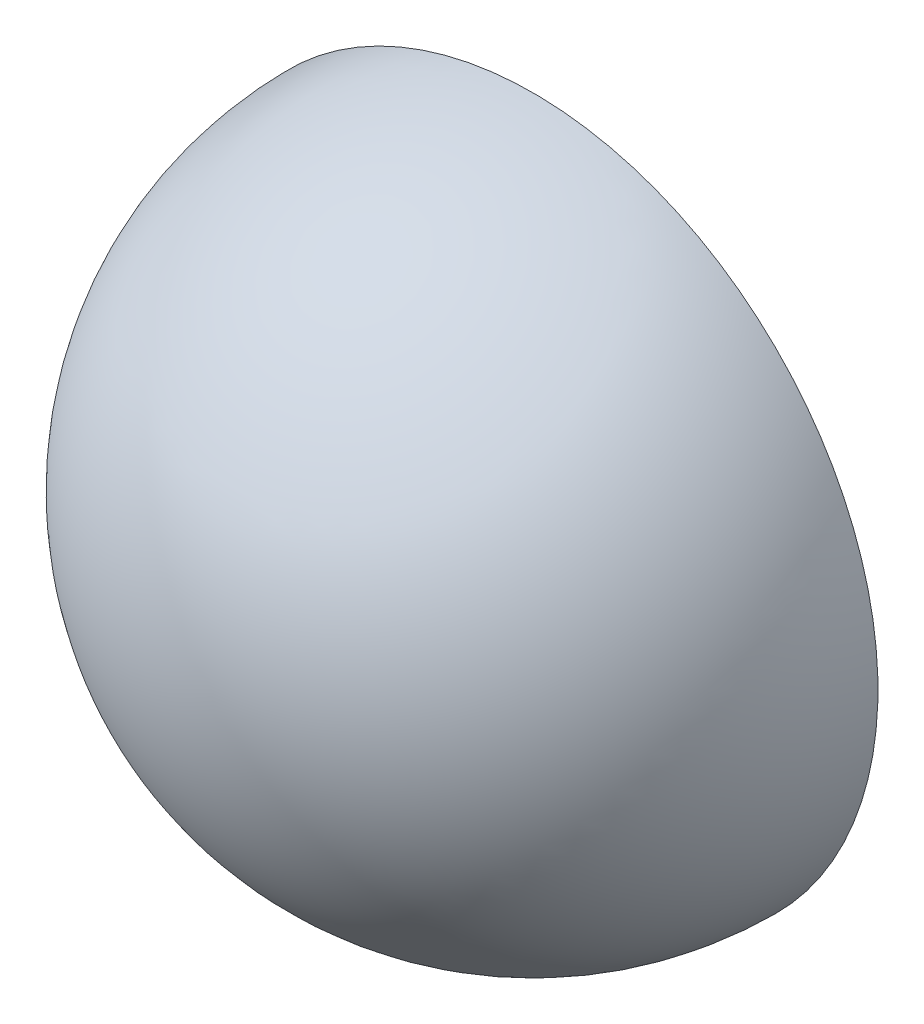
ISO-10303-21;
HEADER;
FILE_DESCRIPTION(('STEP AP214'),'2;1');
FILE_NAME('part.step','',(''),(''),'','','');
FILE_SCHEMA(('AUTOMOTIVE_DESIGN { 1 0 10303 214 1 1 1 1 }'));
ENDSEC;
DATA;
#1=APPLICATION_CONTEXT('core data for automotive mechanical design processes');
#2=APPLICATION_PROTOCOL_DEFINITION('international standard','automotive_design',2000,#1);
#3=PRODUCT_CONTEXT('',#1,'mechanical');
#4=PRODUCT('Part','Part','',(#3));
#5=PRODUCT_RELATED_PRODUCT_CATEGORY('part','',(#4));
#6=PRODUCT_DEFINITION_FORMATION('','',#4);
#7=PRODUCT_DEFINITION_CONTEXT('part definition',#1,'design');
#8=PRODUCT_DEFINITION('design','',#6,#7);
#9=PRODUCT_DEFINITION_SHAPE('','',#8);
#10=(LENGTH_UNIT() NAMED_UNIT(*) SI_UNIT(.MILLI.,.METRE.));
#11=(NAMED_UNIT(*) PLANE_ANGLE_UNIT() SI_UNIT($,.RADIAN.));
#12=(NAMED_UNIT(*) SI_UNIT($,.STERADIAN.) SOLID_ANGLE_UNIT());
#13=UNCERTAINTY_MEASURE_WITH_UNIT(LENGTH_MEASURE(1.E-05),#10,'distance_accuracy_value','');
#14=(GEOMETRIC_REPRESENTATION_CONTEXT(3) GLOBAL_UNCERTAINTY_ASSIGNED_CONTEXT((#13)) GLOBAL_UNIT_ASSIGNED_CONTEXT((#10,
#11,#12)) REPRESENTATION_CONTEXT('',''));
#15=CARTESIAN_POINT('',(0.,0.,0.));
#16=DIRECTION('',(0.,0.,1.));
#17=DIRECTION('',(1.,0.,0.));
#18=AXIS2_PLACEMENT_3D('',#15,#16,#17);
#19=CARTESIAN_POINT('',(0.,0.,0.));
#20=DIRECTION('',(-1.,0.,0.));
#21=DIRECTION('',(0.,-1.,0.));
#22=AXIS2_PLACEMENT_3D('',#19,#20,#21);
#23=SPHERICAL_SURFACE('',#22,13.65);
#24=CARTESIAN_POINT('',(0.,0.,0.));
#25=DIRECTION('',(0.,0.,-1.));
#26=DIRECTION('',(-1.,0.,0.));
#27=AXIS2_PLACEMENT_3D('',#24,#25,#26);
#28=SPHERICAL_SURFACE('',#27,13.65);
#29=CARTESIAN_POINT('',(0.,0.,0.));
#30=DIRECTION('',(0.,0.,-1.));
#31=DIRECTION('',(-1.,0.,0.));
#32=AXIS2_PLACEMENT_3D('',#29,#30,#31);
#33=CIRCLE('',#32,13.65);
#34=CARTESIAN_POINT('',(-13.65,0.,0.));
#35=VERTEX_POINT('',#34);
#36=EDGE_CURVE('E10',#35,#35,#33,.T.);
#37=ORIENTED_EDGE('',*,*,#36,.F.);
#38=EDGE_LOOP('',(#37));
#39=FACE_BOUND('',#38,.T.);
#40=ADVANCED_FACE('F31',(#39),#28,.T.);
#41=CARTESIAN_POINT('',(0.,0.,0.));
#42=DIRECTION('',(0.,0.,1.));
#43=DIRECTION('',(-1.,0.,0.));
#44=AXIS2_PLACEMENT_3D('',#41,#42,#43);
#45=PLANE('',#44);
#46=ORIENTED_EDGE('',*,*,#36,.T.);
#47=EDGE_LOOP('',(#46));
#48=FACE_BOUND('',#47,.T.);
#49=ADVANCED_FACE('F38',(#48),#45,.F.);
#50=CLOSED_SHELL('',(#40,#49));
#51=MANIFOLD_SOLID_BREP('B2',#50);
#52=ADVANCED_BREP_SHAPE_REPRESENTATION('',(#18,#51),#14);
#53=SHAPE_DEFINITION_REPRESENTATION(#9,#52);
ENDSEC;
END-ISO-10303-21;
